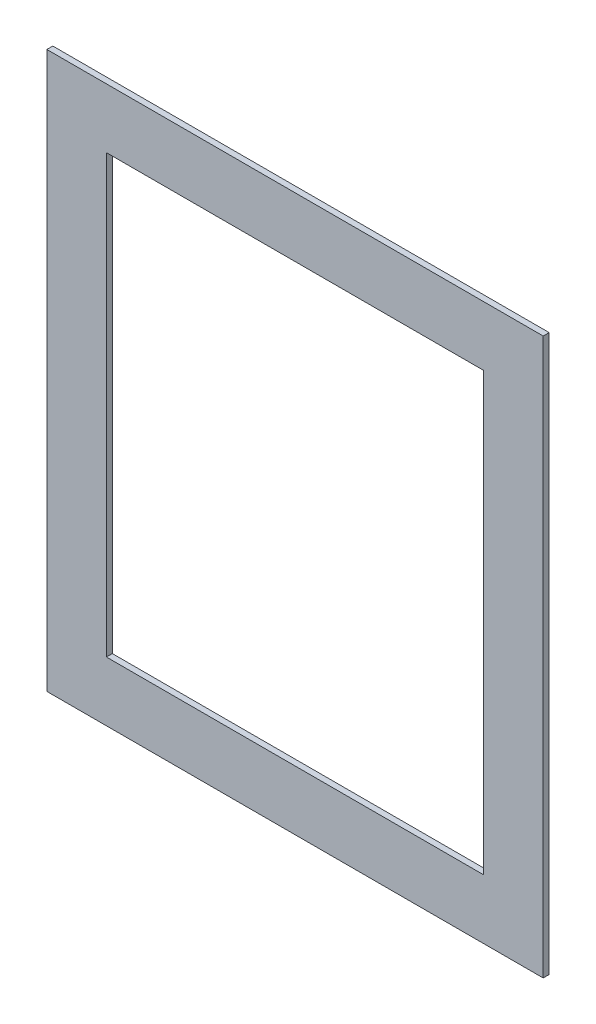
ISO-10303-21;
HEADER;
FILE_DESCRIPTION(('STEP AP214'),'2;1');
FILE_NAME('part.step','',(''),(''),'','','');
FILE_SCHEMA(('AUTOMOTIVE_DESIGN { 1 0 10303 214 1 1 1 1 }'));
ENDSEC;
DATA;
#1=APPLICATION_CONTEXT('core data for automotive mechanical design processes');
#2=APPLICATION_PROTOCOL_DEFINITION('international standard','automotive_design',2000,#1);
#3=PRODUCT_CONTEXT('',#1,'mechanical');
#4=PRODUCT('Part','Part','',(#3));
#5=PRODUCT_RELATED_PRODUCT_CATEGORY('part','',(#4));
#6=PRODUCT_DEFINITION_FORMATION('','',#4);
#7=PRODUCT_DEFINITION_CONTEXT('part definition',#1,'design');
#8=PRODUCT_DEFINITION('design','',#6,#7);
#9=PRODUCT_DEFINITION_SHAPE('','',#8);
#10=(LENGTH_UNIT() NAMED_UNIT(*) SI_UNIT(.MILLI.,.METRE.));
#11=(NAMED_UNIT(*) PLANE_ANGLE_UNIT() SI_UNIT($,.RADIAN.));
#12=(NAMED_UNIT(*) SI_UNIT($,.STERADIAN.) SOLID_ANGLE_UNIT());
#13=UNCERTAINTY_MEASURE_WITH_UNIT(LENGTH_MEASURE(1.E-05),#10,'distance_accuracy_value','');
#14=(GEOMETRIC_REPRESENTATION_CONTEXT(3) GLOBAL_UNCERTAINTY_ASSIGNED_CONTEXT((#13)) GLOBAL_UNIT_ASSIGNED_CONTEXT((#10,
#11,#12)) REPRESENTATION_CONTEXT('',''));
#15=CARTESIAN_POINT('',(0.,0.,0.));
#16=DIRECTION('',(0.,0.,1.));
#17=DIRECTION('',(1.,0.,0.));
#18=AXIS2_PLACEMENT_3D('',#15,#16,#17);
#19=CARTESIAN_POINT('',(0.,0.,6.));
#20=DIRECTION('',(0.,0.,1.));
#21=DIRECTION('',(1.,0.,0.));
#22=AXIS2_PLACEMENT_3D('',#19,#20,#21);
#23=PLANE('',#22);
#24=DIRECTION('',(0.,-1.,0.));
#25=VECTOR('',#24,1.);
#26=CARTESIAN_POINT('',(-61.6497728016074,540.464227839491,6.));
#27=LINE('',#26,#25);
#28=CARTESIAN_POINT('',(-61.6497728016074,540.464227839491,6.));
#29=VERTEX_POINT('',#28);
#30=CARTESIAN_POINT('',(-61.6497728016073,-19.5357721605093,6.));
#31=VERTEX_POINT('',#30);
#32=EDGE_CURVE('E153',#29,#31,#27,.T.);
#33=ORIENTED_EDGE('',*,*,#32,.T.);
#34=DIRECTION('',(1.,0.,0.));
#35=VECTOR('',#34,1.);
#36=CARTESIAN_POINT('',(-61.6497728016073,-19.5357721605093,6.));
#37=LINE('',#36,#35);
#38=CARTESIAN_POINT('',(438.350227198393,-19.5357721605093,6.));
#39=VERTEX_POINT('',#38);
#40=EDGE_CURVE('E157',#31,#39,#37,.T.);
#41=ORIENTED_EDGE('',*,*,#40,.T.);
#42=DIRECTION('',(0.,1.,0.));
#43=VECTOR('',#42,1.);
#44=CARTESIAN_POINT('',(438.350227198393,540.464227839491,6.));
#45=LINE('',#44,#43);
#46=CARTESIAN_POINT('',(438.350227198393,540.464227839491,6.));
#47=VERTEX_POINT('',#46);
#48=EDGE_CURVE('E161',#39,#47,#45,.T.);
#49=ORIENTED_EDGE('',*,*,#48,.T.);
#50=DIRECTION('',(-1.,0.,0.));
#51=VECTOR('',#50,1.);
#52=CARTESIAN_POINT('',(-61.6497728016074,540.464227839491,6.));
#53=LINE('',#52,#51);
#54=EDGE_CURVE('E164',#47,#29,#53,.T.);
#55=ORIENTED_EDGE('',*,*,#54,.T.);
#56=EDGE_LOOP('',(#33,#41,#49,#55));
#57=FACE_BOUND('',#56,.T.);
#58=DIRECTION('',(0.,-1.,0.));
#59=VECTOR('',#58,1.);
#60=CARTESIAN_POINT('',(-1.6497728016074,480.464227839491,6.));
#61=LINE('',#60,#59);
#62=CARTESIAN_POINT('',(-1.6497728016074,480.464227839491,6.));
#63=VERTEX_POINT('',#62);
#64=CARTESIAN_POINT('',(-1.6497728016074,40.4642278394907,6.));
#65=VERTEX_POINT('',#64);
#66=EDGE_CURVE('E114',#63,#65,#61,.T.);
#67=ORIENTED_EDGE('',*,*,#66,.F.);
#68=DIRECTION('',(-1.,0.,0.));
#69=VECTOR('',#68,1.);
#70=CARTESIAN_POINT('',(-1.6497728016074,480.464227839491,6.));
#71=LINE('',#70,#69);
#72=CARTESIAN_POINT('',(378.350227198393,480.464227839491,6.));
#73=VERTEX_POINT('',#72);
#74=EDGE_CURVE('E105',#73,#63,#71,.T.);
#75=ORIENTED_EDGE('',*,*,#74,.F.);
#76=DIRECTION('',(0.,1.,0.));
#77=VECTOR('',#76,1.);
#78=CARTESIAN_POINT('',(378.350227198393,480.464227839491,6.));
#79=LINE('',#78,#77);
#80=CARTESIAN_POINT('',(378.350227198393,40.4642278394907,6.));
#81=VERTEX_POINT('',#80);
#82=EDGE_CURVE('E131',#81,#73,#79,.T.);
#83=ORIENTED_EDGE('',*,*,#82,.F.);
#84=DIRECTION('',(1.,0.,0.));
#85=VECTOR('',#84,1.);
#86=CARTESIAN_POINT('',(-1.6497728016074,40.4642278394907,6.));
#87=LINE('',#86,#85);
#88=EDGE_CURVE('E127',#65,#81,#87,.T.);
#89=ORIENTED_EDGE('',*,*,#88,.F.);
#90=EDGE_LOOP('',(#67,#75,#83,#89));
#91=FACE_BOUND('',#90,.T.);
#92=ADVANCED_FACE('F39',(#57,#91),#23,.T.);
#93=CARTESIAN_POINT('',(0.,0.,0.));
#94=DIRECTION('',(0.,0.,1.));
#95=DIRECTION('',(1.,0.,0.));
#96=AXIS2_PLACEMENT_3D('',#93,#94,#95);
#97=PLANE('',#96);
#98=DIRECTION('',(0.,-1.,0.));
#99=VECTOR('',#98,1.);
#100=CARTESIAN_POINT('',(-61.6497728016074,540.464227839491,0.));
#101=LINE('',#100,#99);
#102=CARTESIAN_POINT('',(-61.6497728016074,540.464227839491,0.));
#103=VERTEX_POINT('',#102);
#104=CARTESIAN_POINT('',(-61.6497728016073,-19.5357721605093,0.));
#105=VERTEX_POINT('',#104);
#106=EDGE_CURVE('E123',#103,#105,#101,.T.);
#107=ORIENTED_EDGE('',*,*,#106,.F.);
#108=DIRECTION('',(-1.,0.,0.));
#109=VECTOR('',#108,1.);
#110=CARTESIAN_POINT('',(-61.6497728016074,540.464227839491,0.));
#111=LINE('',#110,#109);
#112=CARTESIAN_POINT('',(438.350227198393,540.464227839491,0.));
#113=VERTEX_POINT('',#112);
#114=EDGE_CURVE('E158',#113,#103,#111,.T.);
#115=ORIENTED_EDGE('',*,*,#114,.F.);
#116=DIRECTION('',(0.,1.,0.));
#117=VECTOR('',#116,1.);
#118=CARTESIAN_POINT('',(438.350227198393,540.464227839491,0.));
#119=LINE('',#118,#117);
#120=CARTESIAN_POINT('',(438.350227198393,-19.5357721605093,0.));
#121=VERTEX_POINT('',#120);
#122=EDGE_CURVE('E174',#121,#113,#119,.T.);
#123=ORIENTED_EDGE('',*,*,#122,.F.);
#124=DIRECTION('',(1.,0.,0.));
#125=VECTOR('',#124,1.);
#126=CARTESIAN_POINT('',(-61.6497728016073,-19.5357721605093,0.));
#127=LINE('',#126,#125);
#128=EDGE_CURVE('E171',#105,#121,#127,.T.);
#129=ORIENTED_EDGE('',*,*,#128,.F.);
#130=EDGE_LOOP('',(#107,#115,#123,#129));
#131=FACE_BOUND('',#130,.T.);
#132=DIRECTION('',(-1.,0.,0.));
#133=VECTOR('',#132,1.);
#134=CARTESIAN_POINT('',(-1.6497728016074,480.464227839491,0.));
#135=LINE('',#134,#133);
#136=CARTESIAN_POINT('',(378.350227198393,480.464227839491,0.));
#137=VERTEX_POINT('',#136);
#138=CARTESIAN_POINT('',(-1.6497728016074,480.464227839491,0.));
#139=VERTEX_POINT('',#138);
#140=EDGE_CURVE('E63',#137,#139,#135,.T.);
#141=ORIENTED_EDGE('',*,*,#140,.T.);
#142=DIRECTION('',(0.,-1.,0.));
#143=VECTOR('',#142,1.);
#144=CARTESIAN_POINT('',(-1.6497728016074,480.464227839491,0.));
#145=LINE('',#144,#143);
#146=CARTESIAN_POINT('',(-1.6497728016074,40.4642278394907,0.));
#147=VERTEX_POINT('',#146);
#148=EDGE_CURVE('E121',#139,#147,#145,.T.);
#149=ORIENTED_EDGE('',*,*,#148,.T.);
#150=DIRECTION('',(1.,0.,0.));
#151=VECTOR('',#150,1.);
#152=CARTESIAN_POINT('',(-1.6497728016074,40.4642278394907,0.));
#153=LINE('',#152,#151);
#154=CARTESIAN_POINT('',(378.350227198393,40.4642278394907,0.));
#155=VERTEX_POINT('',#154);
#156=EDGE_CURVE('E140',#147,#155,#153,.T.);
#157=ORIENTED_EDGE('',*,*,#156,.T.);
#158=DIRECTION('',(0.,1.,0.));
#159=VECTOR('',#158,1.);
#160=CARTESIAN_POINT('',(378.350227198393,480.464227839491,0.));
#161=LINE('',#160,#159);
#162=EDGE_CURVE('E115',#155,#137,#161,.T.);
#163=ORIENTED_EDGE('',*,*,#162,.T.);
#164=EDGE_LOOP('',(#141,#149,#157,#163));
#165=FACE_BOUND('',#164,.T.);
#166=ADVANCED_FACE('F197',(#131,#165),#97,.F.);
#167=CARTESIAN_POINT('',(-61.6497728016074,540.464227839491,6.));
#168=DIRECTION('',(1.,0.,0.));
#169=DIRECTION('',(0.,1.,0.));
#170=AXIS2_PLACEMENT_3D('',#167,#168,#169);
#171=PLANE('',#170);
#172=ORIENTED_EDGE('',*,*,#106,.T.);
#173=DIRECTION('',(0.,0.,-1.));
#174=VECTOR('',#173,1.);
#175=CARTESIAN_POINT('',(-61.6497728016073,-19.5357721605093,6.));
#176=LINE('',#175,#174);
#177=EDGE_CURVE('E11',#31,#105,#176,.T.);
#178=ORIENTED_EDGE('',*,*,#177,.F.);
#179=ORIENTED_EDGE('',*,*,#32,.F.);
#180=DIRECTION('',(0.,0.,-1.));
#181=VECTOR('',#180,1.);
#182=CARTESIAN_POINT('',(-61.6497728016074,540.464227839491,6.));
#183=LINE('',#182,#181);
#184=EDGE_CURVE('E167',#29,#103,#183,.T.);
#185=ORIENTED_EDGE('',*,*,#184,.T.);
#186=EDGE_LOOP('',(#172,#178,#179,#185));
#187=FACE_BOUND('',#186,.T.);
#188=ADVANCED_FACE('F41',(#187),#171,.F.);
#189=CARTESIAN_POINT('',(-61.6497728016073,-19.5357721605093,6.));
#190=DIRECTION('',(0.,1.,0.));
#191=DIRECTION('',(0.,0.,1.));
#192=AXIS2_PLACEMENT_3D('',#189,#190,#191);
#193=PLANE('',#192);
#194=ORIENTED_EDGE('',*,*,#128,.T.);
#195=DIRECTION('',(0.,0.,-1.));
#196=VECTOR('',#195,1.);
#197=CARTESIAN_POINT('',(438.350227198393,-19.5357721605093,6.));
#198=LINE('',#197,#196);
#199=EDGE_CURVE('E48',#39,#121,#198,.T.);
#200=ORIENTED_EDGE('',*,*,#199,.F.);
#201=ORIENTED_EDGE('',*,*,#40,.F.);
#202=ORIENTED_EDGE('',*,*,#177,.T.);
#203=EDGE_LOOP('',(#194,#200,#201,#202));
#204=FACE_BOUND('',#203,.T.);
#205=ADVANCED_FACE('F207',(#204),#193,.F.);
#206=CARTESIAN_POINT('',(438.350227198393,540.464227839491,6.));
#207=DIRECTION('',(-1.,0.,0.));
#208=DIRECTION('',(0.,-1.,0.));
#209=AXIS2_PLACEMENT_3D('',#206,#207,#208);
#210=PLANE('',#209);
#211=ORIENTED_EDGE('',*,*,#122,.T.);
#212=DIRECTION('',(0.,0.,-1.));
#213=VECTOR('',#212,1.);
#214=CARTESIAN_POINT('',(438.350227198393,540.464227839491,6.));
#215=LINE('',#214,#213);
#216=EDGE_CURVE('E182',#47,#113,#215,.T.);
#217=ORIENTED_EDGE('',*,*,#216,.F.);
#218=ORIENTED_EDGE('',*,*,#48,.F.);
#219=ORIENTED_EDGE('',*,*,#199,.T.);
#220=EDGE_LOOP('',(#211,#217,#218,#219));
#221=FACE_BOUND('',#220,.T.);
#222=ADVANCED_FACE('F191',(#221),#210,.F.);
#223=CARTESIAN_POINT('',(-61.6497728016074,540.464227839491,6.));
#224=DIRECTION('',(0.,-1.,0.));
#225=DIRECTION('',(0.,0.,-1.));
#226=AXIS2_PLACEMENT_3D('',#223,#224,#225);
#227=PLANE('',#226);
#228=ORIENTED_EDGE('',*,*,#114,.T.);
#229=ORIENTED_EDGE('',*,*,#184,.F.);
#230=ORIENTED_EDGE('',*,*,#54,.F.);
#231=ORIENTED_EDGE('',*,*,#216,.T.);
#232=EDGE_LOOP('',(#228,#229,#230,#231));
#233=FACE_BOUND('',#232,.T.);
#234=ADVANCED_FACE('F201',(#233),#227,.F.);
#235=CARTESIAN_POINT('',(-1.6497728016074,480.464227839491,6.));
#236=DIRECTION('',(0.,-1.,0.));
#237=DIRECTION('',(0.,0.,-1.));
#238=AXIS2_PLACEMENT_3D('',#235,#236,#237);
#239=PLANE('',#238);
#240=ORIENTED_EDGE('',*,*,#140,.F.);
#241=DIRECTION('',(0.,0.,-1.));
#242=VECTOR('',#241,1.);
#243=CARTESIAN_POINT('',(378.350227198393,480.464227839491,6.));
#244=LINE('',#243,#242);
#245=EDGE_CURVE('E109',#73,#137,#244,.T.);
#246=ORIENTED_EDGE('',*,*,#245,.F.);
#247=ORIENTED_EDGE('',*,*,#74,.T.);
#248=DIRECTION('',(0.,0.,-1.));
#249=VECTOR('',#248,1.);
#250=CARTESIAN_POINT('',(-1.6497728016074,480.464227839491,6.));
#251=LINE('',#250,#249);
#252=EDGE_CURVE('E108',#63,#139,#251,.T.);
#253=ORIENTED_EDGE('',*,*,#252,.T.);
#254=EDGE_LOOP('',(#240,#246,#247,#253));
#255=FACE_BOUND('',#254,.T.);
#256=ADVANCED_FACE('F107',(#255),#239,.T.);
#257=CARTESIAN_POINT('',(-1.6497728016074,480.464227839491,6.));
#258=DIRECTION('',(1.,0.,0.));
#259=DIRECTION('',(0.,0.,-1.));
#260=AXIS2_PLACEMENT_3D('',#257,#258,#259);
#261=PLANE('',#260);
#262=ORIENTED_EDGE('',*,*,#148,.F.);
#263=ORIENTED_EDGE('',*,*,#252,.F.);
#264=ORIENTED_EDGE('',*,*,#66,.T.);
#265=DIRECTION('',(0.,0.,-1.));
#266=VECTOR('',#265,1.);
#267=CARTESIAN_POINT('',(-1.6497728016074,40.4642278394907,6.));
#268=LINE('',#267,#266);
#269=EDGE_CURVE('E124',#65,#147,#268,.T.);
#270=ORIENTED_EDGE('',*,*,#269,.T.);
#271=EDGE_LOOP('',(#262,#263,#264,#270));
#272=FACE_BOUND('',#271,.T.);
#273=ADVANCED_FACE('F118',(#272),#261,.T.);
#274=CARTESIAN_POINT('',(-1.6497728016074,40.4642278394907,6.));
#275=DIRECTION('',(0.,1.,0.));
#276=DIRECTION('',(0.,0.,1.));
#277=AXIS2_PLACEMENT_3D('',#274,#275,#276);
#278=PLANE('',#277);
#279=ORIENTED_EDGE('',*,*,#156,.F.);
#280=ORIENTED_EDGE('',*,*,#269,.F.);
#281=ORIENTED_EDGE('',*,*,#88,.T.);
#282=DIRECTION('',(0.,0.,-1.));
#283=VECTOR('',#282,1.);
#284=CARTESIAN_POINT('',(378.350227198393,40.4642278394907,6.));
#285=LINE('',#284,#283);
#286=EDGE_CURVE('E55',#81,#155,#285,.T.);
#287=ORIENTED_EDGE('',*,*,#286,.T.);
#288=EDGE_LOOP('',(#279,#280,#281,#287));
#289=FACE_BOUND('',#288,.T.);
#290=ADVANCED_FACE('F230',(#289),#278,.T.);
#291=CARTESIAN_POINT('',(378.350227198393,480.464227839491,6.));
#292=DIRECTION('',(-1.,0.,0.));
#293=DIRECTION('',(0.,-1.,0.));
#294=AXIS2_PLACEMENT_3D('',#291,#292,#293);
#295=PLANE('',#294);
#296=ORIENTED_EDGE('',*,*,#162,.F.);
#297=ORIENTED_EDGE('',*,*,#286,.F.);
#298=ORIENTED_EDGE('',*,*,#82,.T.);
#299=ORIENTED_EDGE('',*,*,#245,.T.);
#300=EDGE_LOOP('',(#296,#297,#298,#299));
#301=FACE_BOUND('',#300,.T.);
#302=ADVANCED_FACE('F234',(#301),#295,.T.);
#303=CLOSED_SHELL('',(#92,#166,#188,#205,#222,#234,#256,#273,#290,#302));
#304=MANIFOLD_SOLID_BREP('B2',#303);
#305=ADVANCED_BREP_SHAPE_REPRESENTATION('',(#18,#304),#14);
#306=SHAPE_DEFINITION_REPRESENTATION(#9,#305);
ENDSEC;
END-ISO-10303-21;
